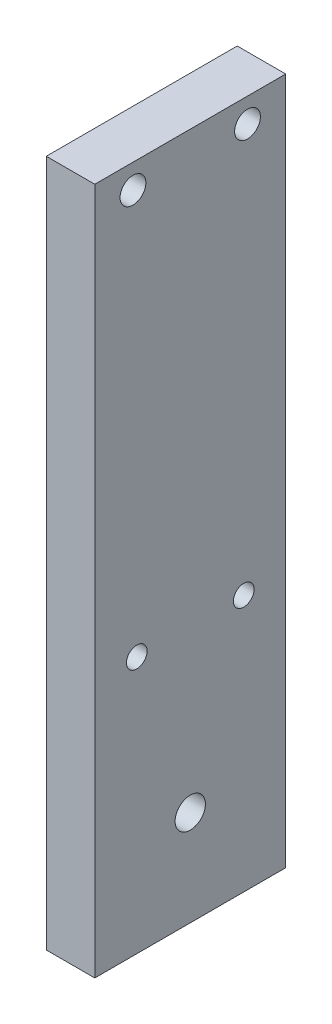
ISO-10303-21;
HEADER;
FILE_DESCRIPTION(('STEP AP214'),'2;1');
FILE_NAME('part.step','',(''),(''),'','','');
FILE_SCHEMA(('AUTOMOTIVE_DESIGN { 1 0 10303 214 1 1 1 1 }'));
ENDSEC;
DATA;
#1=APPLICATION_CONTEXT('core data for automotive mechanical design processes');
#2=APPLICATION_PROTOCOL_DEFINITION('international standard','automotive_design',2000,#1);
#3=PRODUCT_CONTEXT('',#1,'mechanical');
#4=PRODUCT('Part','Part','',(#3));
#5=PRODUCT_RELATED_PRODUCT_CATEGORY('part','',(#4));
#6=PRODUCT_DEFINITION_FORMATION('','',#4);
#7=PRODUCT_DEFINITION_CONTEXT('part definition',#1,'design');
#8=PRODUCT_DEFINITION('design','',#6,#7);
#9=PRODUCT_DEFINITION_SHAPE('','',#8);
#10=(LENGTH_UNIT() NAMED_UNIT(*) SI_UNIT(.MILLI.,.METRE.));
#11=(NAMED_UNIT(*) PLANE_ANGLE_UNIT() SI_UNIT($,.RADIAN.));
#12=(NAMED_UNIT(*) SI_UNIT($,.STERADIAN.) SOLID_ANGLE_UNIT());
#13=UNCERTAINTY_MEASURE_WITH_UNIT(LENGTH_MEASURE(1.E-05),#10,'distance_accuracy_value','');
#14=(GEOMETRIC_REPRESENTATION_CONTEXT(3) GLOBAL_UNCERTAINTY_ASSIGNED_CONTEXT((#13)) GLOBAL_UNIT_ASSIGNED_CONTEXT((#10,
#11,#12)) REPRESENTATION_CONTEXT('',''));
#15=CARTESIAN_POINT('',(0.,0.,0.));
#16=DIRECTION('',(0.,0.,1.));
#17=DIRECTION('',(1.,0.,0.));
#18=AXIS2_PLACEMENT_3D('',#15,#16,#17);
#19=CARTESIAN_POINT('',(6.35,90.,25.));
#20=DIRECTION('',(-1.,0.,0.));
#21=DIRECTION('',(0.,0.,1.));
#22=AXIS2_PLACEMENT_3D('',#19,#20,#21);
#23=PLANE('',#22);
#24=CARTESIAN_POINT('',(6.35,-22.7,-14.));
#25=DIRECTION('',(1.,0.,0.));
#26=DIRECTION('',(0.,0.,-1.));
#27=AXIS2_PLACEMENT_3D('',#24,#25,#26);
#28=CIRCLE('',#27,2.7051);
#29=CARTESIAN_POINT('',(6.35,-22.7,-16.7051));
#30=VERTEX_POINT('',#29);
#31=EDGE_CURVE('E139',#30,#30,#28,.T.);
#32=ORIENTED_EDGE('',*,*,#31,.F.);
#33=EDGE_LOOP('',(#32));
#34=FACE_BOUND('',#33,.T.);
#35=CARTESIAN_POINT('',(6.35000000000001,83.65,-15.));
#36=DIRECTION('',(-1.,0.,0.));
#37=DIRECTION('',(0.,0.,1.));
#38=AXIS2_PLACEMENT_3D('',#35,#36,#37);
#39=CIRCLE('',#38,3.3782);
#40=CARTESIAN_POINT('',(6.35000000000001,83.65,-11.6218));
#41=VERTEX_POINT('',#40);
#42=EDGE_CURVE('E124',#41,#41,#39,.T.);
#43=ORIENTED_EDGE('',*,*,#42,.T.);
#44=EDGE_LOOP('',(#43));
#45=FACE_BOUND('',#44,.T.);
#46=CARTESIAN_POINT('',(6.35000000000001,83.65,15.));
#47=DIRECTION('',(-1.,0.,0.));
#48=DIRECTION('',(0.,0.,1.));
#49=AXIS2_PLACEMENT_3D('',#46,#47,#48);
#50=CIRCLE('',#49,3.3782);
#51=CARTESIAN_POINT('',(6.35000000000001,83.65,18.3782));
#52=VERTEX_POINT('',#51);
#53=EDGE_CURVE('E118',#52,#52,#50,.T.);
#54=ORIENTED_EDGE('',*,*,#53,.T.);
#55=EDGE_LOOP('',(#54));
#56=FACE_BOUND('',#55,.T.);
#57=CARTESIAN_POINT('',(6.35000000000001,-65.,0.));
#58=DIRECTION('',(1.,0.,0.));
#59=DIRECTION('',(0.,0.,-1.));
#60=AXIS2_PLACEMENT_3D('',#57,#58,#59);
#61=CIRCLE('',#60,3.96875);
#62=CARTESIAN_POINT('',(6.35000000000001,-65.,-3.96875));
#63=VERTEX_POINT('',#62);
#64=EDGE_CURVE('E115',#63,#63,#61,.T.);
#65=ORIENTED_EDGE('',*,*,#64,.F.);
#66=EDGE_LOOP('',(#65));
#67=FACE_BOUND('',#66,.T.);
#68=DIRECTION('',(0.,1.,0.));
#69=VECTOR('',#68,1.);
#70=CARTESIAN_POINT('',(6.35,90.,-25.));
#71=LINE('',#70,#69);
#72=CARTESIAN_POINT('',(6.35,-90.,-25.));
#73=VERTEX_POINT('',#72);
#74=CARTESIAN_POINT('',(6.35,90.,-25.));
#75=VERTEX_POINT('',#74);
#76=EDGE_CURVE('E69',#73,#75,#71,.T.);
#77=ORIENTED_EDGE('',*,*,#76,.T.);
#78=DIRECTION('',(0.,0.,-1.));
#79=VECTOR('',#78,1.);
#80=CARTESIAN_POINT('',(6.35,90.,25.));
#81=LINE('',#80,#79);
#82=CARTESIAN_POINT('',(6.35,90.,25.));
#83=VERTEX_POINT('',#82);
#84=EDGE_CURVE('E92',#83,#75,#81,.T.);
#85=ORIENTED_EDGE('',*,*,#84,.F.);
#86=DIRECTION('',(0.,1.,0.));
#87=VECTOR('',#86,1.);
#88=CARTESIAN_POINT('',(6.35,90.,25.));
#89=LINE('',#88,#87);
#90=CARTESIAN_POINT('',(6.35,-90.,25.));
#91=VERTEX_POINT('',#90);
#92=EDGE_CURVE('E85',#91,#83,#89,.T.);
#93=ORIENTED_EDGE('',*,*,#92,.F.);
#94=DIRECTION('',(0.,0.,-1.));
#95=VECTOR('',#94,1.);
#96=CARTESIAN_POINT('',(6.35,-90.,25.));
#97=LINE('',#96,#95);
#98=EDGE_CURVE('E44',#91,#73,#97,.T.);
#99=ORIENTED_EDGE('',*,*,#98,.T.);
#100=EDGE_LOOP('',(#77,#85,#93,#99));
#101=FACE_BOUND('',#100,.T.);
#102=CARTESIAN_POINT('',(6.35,-22.7,14.));
#103=DIRECTION('',(1.,0.,0.));
#104=DIRECTION('',(0.,0.,-1.));
#105=AXIS2_PLACEMENT_3D('',#102,#103,#104);
#106=CIRCLE('',#105,2.7051);
#107=CARTESIAN_POINT('',(6.35,-22.7,11.2949));
#108=VERTEX_POINT('',#107);
#109=EDGE_CURVE('E133',#108,#108,#106,.T.);
#110=ORIENTED_EDGE('',*,*,#109,.F.);
#111=EDGE_LOOP('',(#110));
#112=FACE_BOUND('',#111,.T.);
#113=ADVANCED_FACE('F35',(#34,#45,#56,#67,#101,#112),#23,.F.);
#114=CARTESIAN_POINT('',(-6.35,90.,25.));
#115=DIRECTION('',(1.,0.,0.));
#116=DIRECTION('',(0.,0.,-1.));
#117=AXIS2_PLACEMENT_3D('',#114,#115,#116);
#118=PLANE('',#117);
#119=CARTESIAN_POINT('',(-6.35000000000001,-22.7,-14.));
#120=DIRECTION('',(1.,0.,0.));
#121=DIRECTION('',(0.,0.,-1.));
#122=AXIS2_PLACEMENT_3D('',#119,#120,#121);
#123=CIRCLE('',#122,2.70509999999999);
#124=CARTESIAN_POINT('',(-6.35000000000001,-22.7,-16.7051));
#125=VERTEX_POINT('',#124);
#126=EDGE_CURVE('E136',#125,#125,#123,.T.);
#127=ORIENTED_EDGE('',*,*,#126,.T.);
#128=EDGE_LOOP('',(#127));
#129=FACE_BOUND('',#128,.T.);
#130=CARTESIAN_POINT('',(-6.35000000000001,-22.7,14.));
#131=DIRECTION('',(1.,0.,0.));
#132=DIRECTION('',(0.,0.,-1.));
#133=AXIS2_PLACEMENT_3D('',#130,#131,#132);
#134=CIRCLE('',#133,2.70509999999999);
#135=CARTESIAN_POINT('',(-6.35000000000001,-22.7,11.2949));
#136=VERTEX_POINT('',#135);
#137=EDGE_CURVE('E130',#136,#136,#134,.T.);
#138=ORIENTED_EDGE('',*,*,#137,.T.);
#139=EDGE_LOOP('',(#138));
#140=FACE_BOUND('',#139,.T.);
#141=CARTESIAN_POINT('',(-6.35,83.65,-15.));
#142=DIRECTION('',(-1.,0.,0.));
#143=DIRECTION('',(0.,0.,1.));
#144=AXIS2_PLACEMENT_3D('',#141,#142,#143);
#145=CIRCLE('',#144,3.3782);
#146=CARTESIAN_POINT('',(-6.35,83.65,-11.6218));
#147=VERTEX_POINT('',#146);
#148=EDGE_CURVE('E127',#147,#147,#145,.T.);
#149=ORIENTED_EDGE('',*,*,#148,.F.);
#150=EDGE_LOOP('',(#149));
#151=FACE_BOUND('',#150,.T.);
#152=CARTESIAN_POINT('',(-6.35,83.65,15.));
#153=DIRECTION('',(-1.,0.,0.));
#154=DIRECTION('',(0.,0.,1.));
#155=AXIS2_PLACEMENT_3D('',#152,#153,#154);
#156=CIRCLE('',#155,3.3782);
#157=CARTESIAN_POINT('',(-6.35,83.65,18.3782));
#158=VERTEX_POINT('',#157);
#159=EDGE_CURVE('E121',#158,#158,#156,.T.);
#160=ORIENTED_EDGE('',*,*,#159,.F.);
#161=EDGE_LOOP('',(#160));
#162=FACE_BOUND('',#161,.T.);
#163=CARTESIAN_POINT('',(-6.35000000000001,-65.,0.));
#164=DIRECTION('',(1.,0.,0.));
#165=DIRECTION('',(0.,0.,-1.));
#166=AXIS2_PLACEMENT_3D('',#163,#164,#165);
#167=CIRCLE('',#166,3.96874999999999);
#168=CARTESIAN_POINT('',(-6.35000000000001,-65.,-3.96874999999999));
#169=VERTEX_POINT('',#168);
#170=EDGE_CURVE('E102',#169,#169,#167,.T.);
#171=ORIENTED_EDGE('',*,*,#170,.T.);
#172=EDGE_LOOP('',(#171));
#173=FACE_BOUND('',#172,.T.);
#174=DIRECTION('',(0.,-1.,0.));
#175=VECTOR('',#174,1.);
#176=CARTESIAN_POINT('',(-6.35,90.,-25.));
#177=LINE('',#176,#175);
#178=CARTESIAN_POINT('',(-6.35,90.,-25.));
#179=VERTEX_POINT('',#178);
#180=CARTESIAN_POINT('',(-6.35,-90.,-25.));
#181=VERTEX_POINT('',#180);
#182=EDGE_CURVE('E99',#179,#181,#177,.T.);
#183=ORIENTED_EDGE('',*,*,#182,.T.);
#184=DIRECTION('',(0.,0.,-1.));
#185=VECTOR('',#184,1.);
#186=CARTESIAN_POINT('',(-6.35,-90.,25.));
#187=LINE('',#186,#185);
#188=CARTESIAN_POINT('',(-6.35,-90.,25.));
#189=VERTEX_POINT('',#188);
#190=EDGE_CURVE('E11',#189,#181,#187,.T.);
#191=ORIENTED_EDGE('',*,*,#190,.F.);
#192=DIRECTION('',(0.,-1.,0.));
#193=VECTOR('',#192,1.);
#194=CARTESIAN_POINT('',(-6.35,90.,25.));
#195=LINE('',#194,#193);
#196=CARTESIAN_POINT('',(-6.35,90.,25.));
#197=VERTEX_POINT('',#196);
#198=EDGE_CURVE('E87',#197,#189,#195,.T.);
#199=ORIENTED_EDGE('',*,*,#198,.F.);
#200=DIRECTION('',(0.,0.,-1.));
#201=VECTOR('',#200,1.);
#202=CARTESIAN_POINT('',(-6.35,90.,25.));
#203=LINE('',#202,#201);
#204=EDGE_CURVE('E95',#197,#179,#203,.T.);
#205=ORIENTED_EDGE('',*,*,#204,.T.);
#206=EDGE_LOOP('',(#183,#191,#199,#205));
#207=FACE_BOUND('',#206,.T.);
#208=ADVANCED_FACE('F37',(#129,#140,#151,#162,#173,#207),#118,.F.);
#209=CARTESIAN_POINT('',(-6.35,-90.,25.));
#210=DIRECTION('',(0.,1.,0.));
#211=DIRECTION('',(0.,0.,1.));
#212=AXIS2_PLACEMENT_3D('',#209,#210,#211);
#213=PLANE('',#212);
#214=DIRECTION('',(1.,0.,0.));
#215=VECTOR('',#214,1.);
#216=CARTESIAN_POINT('',(-6.35,-90.,-25.));
#217=LINE('',#216,#215);
#218=EDGE_CURVE('E91',#181,#73,#217,.T.);
#219=ORIENTED_EDGE('',*,*,#218,.T.);
#220=ORIENTED_EDGE('',*,*,#98,.F.);
#221=DIRECTION('',(1.,0.,0.));
#222=VECTOR('',#221,1.);
#223=CARTESIAN_POINT('',(-6.35,-90.,25.));
#224=LINE('',#223,#222);
#225=EDGE_CURVE('E82',#189,#91,#224,.T.);
#226=ORIENTED_EDGE('',*,*,#225,.F.);
#227=ORIENTED_EDGE('',*,*,#190,.T.);
#228=EDGE_LOOP('',(#219,#220,#226,#227));
#229=FACE_BOUND('',#228,.T.);
#230=ADVANCED_FACE('F90',(#229),#213,.F.);
#231=CARTESIAN_POINT('',(-6.35,90.,25.));
#232=DIRECTION('',(0.,-1.,0.));
#233=DIRECTION('',(0.,0.,-1.));
#234=AXIS2_PLACEMENT_3D('',#231,#232,#233);
#235=PLANE('',#234);
#236=DIRECTION('',(-1.,0.,0.));
#237=VECTOR('',#236,1.);
#238=CARTESIAN_POINT('',(-6.35,90.,-25.));
#239=LINE('',#238,#237);
#240=EDGE_CURVE('E75',#75,#179,#239,.T.);
#241=ORIENTED_EDGE('',*,*,#240,.T.);
#242=ORIENTED_EDGE('',*,*,#204,.F.);
#243=DIRECTION('',(-1.,0.,0.));
#244=VECTOR('',#243,1.);
#245=CARTESIAN_POINT('',(-6.35,90.,25.));
#246=LINE('',#245,#244);
#247=EDGE_CURVE('E52',#83,#197,#246,.T.);
#248=ORIENTED_EDGE('',*,*,#247,.F.);
#249=ORIENTED_EDGE('',*,*,#84,.T.);
#250=EDGE_LOOP('',(#241,#242,#248,#249));
#251=FACE_BOUND('',#250,.T.);
#252=ADVANCED_FACE('F107',(#251),#235,.F.);
#253=CARTESIAN_POINT('',(0.,0.,25.));
#254=DIRECTION('',(0.,0.,1.));
#255=DIRECTION('',(1.,0.,0.));
#256=AXIS2_PLACEMENT_3D('',#253,#254,#255);
#257=PLANE('',#256);
#258=ORIENTED_EDGE('',*,*,#198,.T.);
#259=ORIENTED_EDGE('',*,*,#225,.T.);
#260=ORIENTED_EDGE('',*,*,#92,.T.);
#261=ORIENTED_EDGE('',*,*,#247,.T.);
#262=EDGE_LOOP('',(#258,#259,#260,#261));
#263=FACE_BOUND('',#262,.T.);
#264=ADVANCED_FACE('F83',(#263),#257,.T.);
#265=CARTESIAN_POINT('',(0.,0.,-25.));
#266=DIRECTION('',(0.,0.,1.));
#267=DIRECTION('',(1.,0.,0.));
#268=AXIS2_PLACEMENT_3D('',#265,#266,#267);
#269=PLANE('',#268);
#270=ORIENTED_EDGE('',*,*,#182,.F.);
#271=ORIENTED_EDGE('',*,*,#240,.F.);
#272=ORIENTED_EDGE('',*,*,#76,.F.);
#273=ORIENTED_EDGE('',*,*,#218,.F.);
#274=EDGE_LOOP('',(#270,#271,#272,#273));
#275=FACE_BOUND('',#274,.T.);
#276=ADVANCED_FACE('F110',(#275),#269,.F.);
#277=CARTESIAN_POINT('',(6.35000000000001,-65.,0.));
#278=DIRECTION('',(1.,0.,0.));
#279=DIRECTION('',(0.,0.,-1.));
#280=AXIS2_PLACEMENT_3D('',#277,#278,#279);
#281=CYLINDRICAL_SURFACE('',#280,3.96875);
#282=ORIENTED_EDGE('',*,*,#170,.F.);
#283=EDGE_LOOP('',(#282));
#284=FACE_BOUND('',#283,.T.);
#285=ORIENTED_EDGE('',*,*,#64,.T.);
#286=EDGE_LOOP('',(#285));
#287=FACE_BOUND('',#286,.T.);
#288=ADVANCED_FACE('F154',(#284,#287),#281,.F.);
#289=CARTESIAN_POINT('',(-6.35,83.65,15.));
#290=DIRECTION('',(-1.,0.,0.));
#291=DIRECTION('',(0.,0.,1.));
#292=AXIS2_PLACEMENT_3D('',#289,#290,#291);
#293=CYLINDRICAL_SURFACE('',#292,3.3782);
#294=ORIENTED_EDGE('',*,*,#53,.F.);
#295=EDGE_LOOP('',(#294));
#296=FACE_BOUND('',#295,.T.);
#297=ORIENTED_EDGE('',*,*,#159,.T.);
#298=EDGE_LOOP('',(#297));
#299=FACE_BOUND('',#298,.T.);
#300=ADVANCED_FACE('F156',(#296,#299),#293,.F.);
#301=CARTESIAN_POINT('',(-6.35,83.65,-15.));
#302=DIRECTION('',(-1.,0.,0.));
#303=DIRECTION('',(0.,0.,1.));
#304=AXIS2_PLACEMENT_3D('',#301,#302,#303);
#305=CYLINDRICAL_SURFACE('',#304,3.3782);
#306=ORIENTED_EDGE('',*,*,#42,.F.);
#307=EDGE_LOOP('',(#306));
#308=FACE_BOUND('',#307,.T.);
#309=ORIENTED_EDGE('',*,*,#148,.T.);
#310=EDGE_LOOP('',(#309));
#311=FACE_BOUND('',#310,.T.);
#312=ADVANCED_FACE('F163',(#308,#311),#305,.F.);
#313=CARTESIAN_POINT('',(6.35,-22.7,14.));
#314=DIRECTION('',(1.,0.,0.));
#315=DIRECTION('',(0.,0.,-1.));
#316=AXIS2_PLACEMENT_3D('',#313,#314,#315);
#317=CYLINDRICAL_SURFACE('',#316,2.7051);
#318=ORIENTED_EDGE('',*,*,#137,.F.);
#319=EDGE_LOOP('',(#318));
#320=FACE_BOUND('',#319,.T.);
#321=ORIENTED_EDGE('',*,*,#109,.T.);
#322=EDGE_LOOP('',(#321));
#323=FACE_BOUND('',#322,.T.);
#324=ADVANCED_FACE('F191',(#320,#323),#317,.F.);
#325=CARTESIAN_POINT('',(6.35,-22.7,-14.));
#326=DIRECTION('',(1.,0.,0.));
#327=DIRECTION('',(0.,0.,-1.));
#328=AXIS2_PLACEMENT_3D('',#325,#326,#327);
#329=CYLINDRICAL_SURFACE('',#328,2.7051);
#330=ORIENTED_EDGE('',*,*,#126,.F.);
#331=EDGE_LOOP('',(#330));
#332=FACE_BOUND('',#331,.T.);
#333=ORIENTED_EDGE('',*,*,#31,.T.);
#334=EDGE_LOOP('',(#333));
#335=FACE_BOUND('',#334,.T.);
#336=ADVANCED_FACE('F143',(#332,#335),#329,.F.);
#337=CLOSED_SHELL('',(#113,#208,#230,#252,#264,#276,#288,#300,#312,#324,#336));
#338=MANIFOLD_SOLID_BREP('B2',#337);
#339=ADVANCED_BREP_SHAPE_REPRESENTATION('',(#18,#338),#14);
#340=SHAPE_DEFINITION_REPRESENTATION(#9,#339);
ENDSEC;
END-ISO-10303-21;
